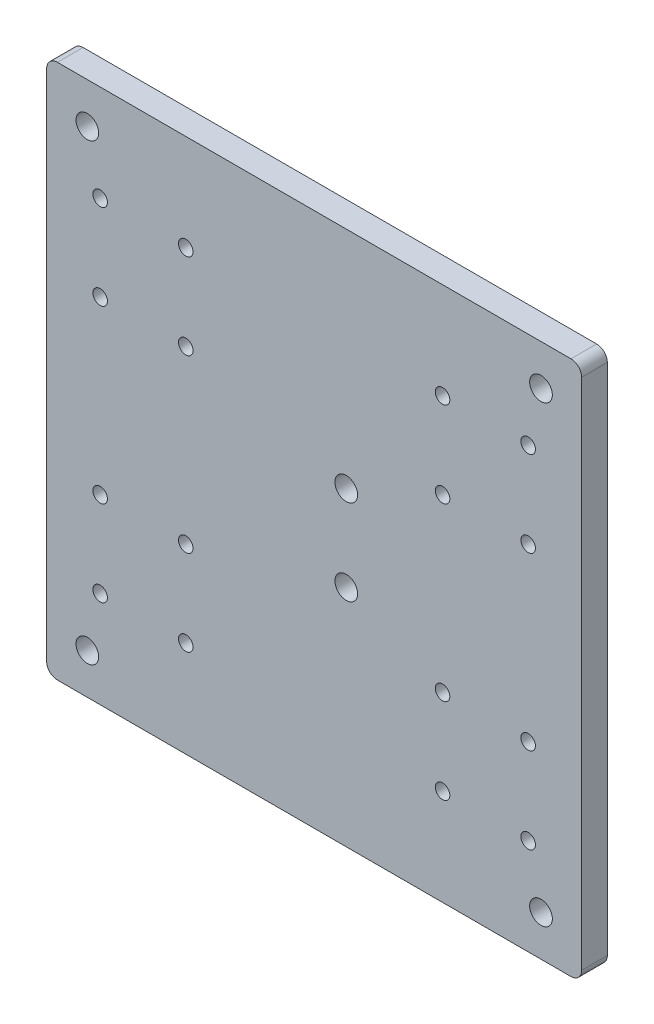
ISO-10303-21;
HEADER;
FILE_DESCRIPTION(('STEP AP214'),'2;1');
FILE_NAME('part.step','',(''),(''),'','','');
FILE_SCHEMA(('AUTOMOTIVE_DESIGN { 1 0 10303 214 1 1 1 1 }'));
ENDSEC;
DATA;
#1=APPLICATION_CONTEXT('core data for automotive mechanical design processes');
#2=APPLICATION_PROTOCOL_DEFINITION('international standard','automotive_design',2000,#1);
#3=PRODUCT_CONTEXT('',#1,'mechanical');
#4=PRODUCT('Part','Part','',(#3));
#5=PRODUCT_RELATED_PRODUCT_CATEGORY('part','',(#4));
#6=PRODUCT_DEFINITION_FORMATION('','',#4);
#7=PRODUCT_DEFINITION_CONTEXT('part definition',#1,'design');
#8=PRODUCT_DEFINITION('design','',#6,#7);
#9=PRODUCT_DEFINITION_SHAPE('','',#8);
#10=(LENGTH_UNIT() NAMED_UNIT(*) SI_UNIT(.MILLI.,.METRE.));
#11=(NAMED_UNIT(*) PLANE_ANGLE_UNIT() SI_UNIT($,.RADIAN.));
#12=(NAMED_UNIT(*) SI_UNIT($,.STERADIAN.) SOLID_ANGLE_UNIT());
#13=UNCERTAINTY_MEASURE_WITH_UNIT(LENGTH_MEASURE(1.E-05),#10,'distance_accuracy_value','');
#14=(GEOMETRIC_REPRESENTATION_CONTEXT(3) GLOBAL_UNCERTAINTY_ASSIGNED_CONTEXT((#13)) GLOBAL_UNIT_ASSIGNED_CONTEXT((#10,
#11,#12)) REPRESENTATION_CONTEXT('',''));
#15=CARTESIAN_POINT('',(0.,0.,0.));
#16=DIRECTION('',(0.,0.,1.));
#17=DIRECTION('',(1.,0.,0.));
#18=AXIS2_PLACEMENT_3D('',#15,#16,#17);
#19=CARTESIAN_POINT('',(0.,0.,6.));
#20=DIRECTION('',(0.,0.,1.));
#21=DIRECTION('',(1.,0.,0.));
#22=AXIS2_PLACEMENT_3D('',#19,#20,#21);
#23=PLANE('',#22);
#24=CARTESIAN_POINT('',(53.,53.,6.));
#25=DIRECTION('',(0.,0.,1.));
#26=DIRECTION('',(1.,0.,0.));
#27=AXIS2_PLACEMENT_3D('',#24,#25,#26);
#28=CIRCLE('',#27,2.65);
#29=CARTESIAN_POINT('',(55.65,53.,6.));
#30=VERTEX_POINT('',#29);
#31=EDGE_CURVE('E302',#30,#30,#28,.T.);
#32=ORIENTED_EDGE('',*,*,#31,.F.);
#33=EDGE_LOOP('',(#32));
#34=FACE_BOUND('',#33,.T.);
#35=CARTESIAN_POINT('',(7.5,-10.,6.));
#36=DIRECTION('',(0.,0.,1.));
#37=DIRECTION('',(1.,0.,0.));
#38=AXIS2_PLACEMENT_3D('',#35,#36,#37);
#39=CIRCLE('',#38,2.65);
#40=CARTESIAN_POINT('',(10.15,-10.,6.));
#41=VERTEX_POINT('',#40);
#42=EDGE_CURVE('E290',#41,#41,#39,.T.);
#43=ORIENTED_EDGE('',*,*,#42,.F.);
#44=EDGE_LOOP('',(#43));
#45=FACE_BOUND('',#44,.T.);
#46=CARTESIAN_POINT('',(50.,-40.,6.));
#47=DIRECTION('',(0.,0.,1.));
#48=DIRECTION('',(1.,0.,0.));
#49=AXIS2_PLACEMENT_3D('',#46,#47,#48);
#50=CIRCLE('',#49,1.7);
#51=CARTESIAN_POINT('',(51.7,-40.,6.));
#52=VERTEX_POINT('',#51);
#53=EDGE_CURVE('E278',#52,#52,#50,.T.);
#54=ORIENTED_EDGE('',*,*,#53,.F.);
#55=EDGE_LOOP('',(#54));
#56=FACE_BOUND('',#55,.T.);
#57=CARTESIAN_POINT('',(30.,-20.,6.));
#58=DIRECTION('',(0.,0.,1.));
#59=DIRECTION('',(1.,0.,0.));
#60=AXIS2_PLACEMENT_3D('',#57,#58,#59);
#61=CIRCLE('',#60,1.69999999999999);
#62=CARTESIAN_POINT('',(31.7,-20.,6.));
#63=VERTEX_POINT('',#62);
#64=EDGE_CURVE('E266',#63,#63,#61,.T.);
#65=ORIENTED_EDGE('',*,*,#64,.F.);
#66=EDGE_LOOP('',(#65));
#67=FACE_BOUND('',#66,.T.);
#68=CARTESIAN_POINT('',(-50.,-40.,6.));
#69=DIRECTION('',(0.,0.,1.));
#70=DIRECTION('',(-1.,0.,0.));
#71=AXIS2_PLACEMENT_3D('',#68,#69,#70);
#72=CIRCLE('',#71,1.7);
#73=CARTESIAN_POINT('',(-51.7,-40.,6.));
#74=VERTEX_POINT('',#73);
#75=EDGE_CURVE('E254',#74,#74,#72,.T.);
#76=ORIENTED_EDGE('',*,*,#75,.F.);
#77=EDGE_LOOP('',(#76));
#78=FACE_BOUND('',#77,.T.);
#79=CARTESIAN_POINT('',(-30.,-20.,6.));
#80=DIRECTION('',(0.,0.,1.));
#81=DIRECTION('',(-1.,0.,0.));
#82=AXIS2_PLACEMENT_3D('',#79,#80,#81);
#83=CIRCLE('',#82,1.7);
#84=CARTESIAN_POINT('',(-31.7,-20.,6.));
#85=VERTEX_POINT('',#84);
#86=EDGE_CURVE('E242',#85,#85,#83,.T.);
#87=ORIENTED_EDGE('',*,*,#86,.F.);
#88=EDGE_LOOP('',(#87));
#89=FACE_BOUND('',#88,.T.);
#90=CARTESIAN_POINT('',(30.,40.,6.));
#91=DIRECTION('',(0.,0.,1.));
#92=DIRECTION('',(-1.,0.,0.));
#93=AXIS2_PLACEMENT_3D('',#90,#91,#92);
#94=CIRCLE('',#93,1.69999999999999);
#95=CARTESIAN_POINT('',(28.3,40.,6.));
#96=VERTEX_POINT('',#95);
#97=EDGE_CURVE('E230',#96,#96,#94,.T.);
#98=ORIENTED_EDGE('',*,*,#97,.F.);
#99=EDGE_LOOP('',(#98));
#100=FACE_BOUND('',#99,.T.);
#101=CARTESIAN_POINT('',(50.,20.,6.));
#102=DIRECTION('',(0.,0.,1.));
#103=DIRECTION('',(-1.,0.,0.));
#104=AXIS2_PLACEMENT_3D('',#101,#102,#103);
#105=CIRCLE('',#104,1.7);
#106=CARTESIAN_POINT('',(48.3,20.,6.));
#107=VERTEX_POINT('',#106);
#108=EDGE_CURVE('E218',#107,#107,#105,.T.);
#109=ORIENTED_EDGE('',*,*,#108,.F.);
#110=EDGE_LOOP('',(#109));
#111=FACE_BOUND('',#110,.T.);
#112=CARTESIAN_POINT('',(-50.,20.,6.));
#113=DIRECTION('',(0.,0.,1.));
#114=DIRECTION('',(1.,0.,0.));
#115=AXIS2_PLACEMENT_3D('',#112,#113,#114);
#116=CIRCLE('',#115,1.7);
#117=CARTESIAN_POINT('',(-48.3,20.,6.));
#118=VERTEX_POINT('',#117);
#119=EDGE_CURVE('E206',#118,#118,#116,.T.);
#120=ORIENTED_EDGE('',*,*,#119,.F.);
#121=EDGE_LOOP('',(#120));
#122=FACE_BOUND('',#121,.T.);
#123=CARTESIAN_POINT('',(-30.,40.,6.));
#124=DIRECTION('',(0.,0.,1.));
#125=DIRECTION('',(1.,0.,0.));
#126=AXIS2_PLACEMENT_3D('',#123,#124,#125);
#127=CIRCLE('',#126,1.7);
#128=CARTESIAN_POINT('',(-28.3,40.,6.));
#129=VERTEX_POINT('',#128);
#130=EDGE_CURVE('E194',#129,#129,#127,.T.);
#131=ORIENTED_EDGE('',*,*,#130,.F.);
#132=EDGE_LOOP('',(#131));
#133=FACE_BOUND('',#132,.T.);
#134=CARTESIAN_POINT('',(-53.,-53.,6.));
#135=DIRECTION('',(0.,0.,1.));
#136=DIRECTION('',(1.,0.,0.));
#137=AXIS2_PLACEMENT_3D('',#134,#135,#136);
#138=CIRCLE('',#137,2.65);
#139=CARTESIAN_POINT('',(-50.35,-53.,6.));
#140=VERTEX_POINT('',#139);
#141=EDGE_CURVE('E140',#140,#140,#138,.T.);
#142=ORIENTED_EDGE('',*,*,#141,.F.);
#143=EDGE_LOOP('',(#142));
#144=FACE_BOUND('',#143,.T.);
#145=DIRECTION('',(0.,-1.,0.));
#146=VECTOR('',#145,1.);
#147=CARTESIAN_POINT('',(-62.5,-62.5,6.));
#148=LINE('',#147,#146);
#149=CARTESIAN_POINT('',(-62.5,60.,6.));
#150=VERTEX_POINT('',#149);
#151=CARTESIAN_POINT('',(-62.5,-60.,6.));
#152=VERTEX_POINT('',#151);
#153=EDGE_CURVE('E145',#150,#152,#148,.T.);
#154=ORIENTED_EDGE('',*,*,#153,.T.);
#155=CARTESIAN_POINT('',(-60.,-60.,6.));
#156=DIRECTION('',(0.,0.,1.));
#157=DIRECTION('',(1.,0.,0.));
#158=AXIS2_PLACEMENT_3D('',#155,#156,#157);
#159=CIRCLE('',#158,2.5);
#160=CARTESIAN_POINT('',(-60.,-62.5,6.));
#161=VERTEX_POINT('',#160);
#162=EDGE_CURVE('E160',#152,#161,#159,.T.);
#163=ORIENTED_EDGE('',*,*,#162,.T.);
#164=DIRECTION('',(1.,0.,0.));
#165=VECTOR('',#164,1.);
#166=CARTESIAN_POINT('',(62.5,-62.5,6.));
#167=LINE('',#166,#165);
#168=CARTESIAN_POINT('',(60.,-62.5,6.));
#169=VERTEX_POINT('',#168);
#170=EDGE_CURVE('E127',#161,#169,#167,.T.);
#171=ORIENTED_EDGE('',*,*,#170,.T.);
#172=CARTESIAN_POINT('',(60.,-60.,6.));
#173=DIRECTION('',(0.,0.,1.));
#174=DIRECTION('',(1.,0.,0.));
#175=AXIS2_PLACEMENT_3D('',#172,#173,#174);
#176=CIRCLE('',#175,2.5);
#177=CARTESIAN_POINT('',(62.5,-60.,6.));
#178=VERTEX_POINT('',#177);
#179=EDGE_CURVE('E158',#169,#178,#176,.T.);
#180=ORIENTED_EDGE('',*,*,#179,.T.);
#181=DIRECTION('',(0.,1.,0.));
#182=VECTOR('',#181,1.);
#183=CARTESIAN_POINT('',(62.5,-62.5,6.));
#184=LINE('',#183,#182);
#185=CARTESIAN_POINT('',(62.5,60.,6.));
#186=VERTEX_POINT('',#185);
#187=EDGE_CURVE('E171',#178,#186,#184,.T.);
#188=ORIENTED_EDGE('',*,*,#187,.T.);
#189=CARTESIAN_POINT('',(60.,60.,6.));
#190=DIRECTION('',(0.,0.,1.));
#191=DIRECTION('',(1.,0.,0.));
#192=AXIS2_PLACEMENT_3D('',#189,#190,#191);
#193=CIRCLE('',#192,2.5);
#194=CARTESIAN_POINT('',(60.,62.5,6.));
#195=VERTEX_POINT('',#194);
#196=EDGE_CURVE('E62',#186,#195,#193,.T.);
#197=ORIENTED_EDGE('',*,*,#196,.T.);
#198=DIRECTION('',(-1.,0.,0.));
#199=VECTOR('',#198,1.);
#200=CARTESIAN_POINT('',(62.5,62.5,6.));
#201=LINE('',#200,#199);
#202=CARTESIAN_POINT('',(-60.,62.5,6.));
#203=VERTEX_POINT('',#202);
#204=EDGE_CURVE('E146',#195,#203,#201,.T.);
#205=ORIENTED_EDGE('',*,*,#204,.T.);
#206=CARTESIAN_POINT('',(-60.,60.,6.));
#207=DIRECTION('',(0.,0.,1.));
#208=DIRECTION('',(1.,0.,0.));
#209=AXIS2_PLACEMENT_3D('',#206,#207,#208);
#210=CIRCLE('',#209,2.5);
#211=EDGE_CURVE('E155',#203,#150,#210,.T.);
#212=ORIENTED_EDGE('',*,*,#211,.T.);
#213=EDGE_LOOP('',(#154,#163,#171,#180,#188,#197,#205,#212));
#214=FACE_BOUND('',#213,.T.);
#215=CARTESIAN_POINT('',(-50.,40.,6.));
#216=DIRECTION('',(0.,0.,1.));
#217=DIRECTION('',(1.,0.,0.));
#218=AXIS2_PLACEMENT_3D('',#215,#216,#217);
#219=CIRCLE('',#218,1.7);
#220=CARTESIAN_POINT('',(-48.3,40.,6.));
#221=VERTEX_POINT('',#220);
#222=EDGE_CURVE('E188',#221,#221,#219,.T.);
#223=ORIENTED_EDGE('',*,*,#222,.F.);
#224=EDGE_LOOP('',(#223));
#225=FACE_BOUND('',#224,.T.);
#226=CARTESIAN_POINT('',(-30.,20.,6.));
#227=DIRECTION('',(0.,0.,1.));
#228=DIRECTION('',(1.,0.,0.));
#229=AXIS2_PLACEMENT_3D('',#226,#227,#228);
#230=CIRCLE('',#229,1.7);
#231=CARTESIAN_POINT('',(-28.3,20.,6.));
#232=VERTEX_POINT('',#231);
#233=EDGE_CURVE('E200',#232,#232,#230,.T.);
#234=ORIENTED_EDGE('',*,*,#233,.F.);
#235=EDGE_LOOP('',(#234));
#236=FACE_BOUND('',#235,.T.);
#237=CARTESIAN_POINT('',(50.,40.,6.));
#238=DIRECTION('',(0.,0.,1.));
#239=DIRECTION('',(-1.,0.,0.));
#240=AXIS2_PLACEMENT_3D('',#237,#238,#239);
#241=CIRCLE('',#240,1.7);
#242=CARTESIAN_POINT('',(48.3,40.,6.));
#243=VERTEX_POINT('',#242);
#244=EDGE_CURVE('E212',#243,#243,#241,.T.);
#245=ORIENTED_EDGE('',*,*,#244,.F.);
#246=EDGE_LOOP('',(#245));
#247=FACE_BOUND('',#246,.T.);
#248=CARTESIAN_POINT('',(30.,20.,6.));
#249=DIRECTION('',(0.,0.,1.));
#250=DIRECTION('',(-1.,0.,0.));
#251=AXIS2_PLACEMENT_3D('',#248,#249,#250);
#252=CIRCLE('',#251,1.69999999999999);
#253=CARTESIAN_POINT('',(28.3,20.,6.));
#254=VERTEX_POINT('',#253);
#255=EDGE_CURVE('E224',#254,#254,#252,.T.);
#256=ORIENTED_EDGE('',*,*,#255,.F.);
#257=EDGE_LOOP('',(#256));
#258=FACE_BOUND('',#257,.T.);
#259=CARTESIAN_POINT('',(-50.,-20.,6.));
#260=DIRECTION('',(0.,0.,1.));
#261=DIRECTION('',(-1.,0.,0.));
#262=AXIS2_PLACEMENT_3D('',#259,#260,#261);
#263=CIRCLE('',#262,1.7);
#264=CARTESIAN_POINT('',(-51.7,-20.,6.));
#265=VERTEX_POINT('',#264);
#266=EDGE_CURVE('E236',#265,#265,#263,.T.);
#267=ORIENTED_EDGE('',*,*,#266,.F.);
#268=EDGE_LOOP('',(#267));
#269=FACE_BOUND('',#268,.T.);
#270=CARTESIAN_POINT('',(-30.,-40.,6.));
#271=DIRECTION('',(0.,0.,1.));
#272=DIRECTION('',(-1.,0.,0.));
#273=AXIS2_PLACEMENT_3D('',#270,#271,#272);
#274=CIRCLE('',#273,1.7);
#275=CARTESIAN_POINT('',(-31.7,-40.,6.));
#276=VERTEX_POINT('',#275);
#277=EDGE_CURVE('E248',#276,#276,#274,.T.);
#278=ORIENTED_EDGE('',*,*,#277,.F.);
#279=EDGE_LOOP('',(#278));
#280=FACE_BOUND('',#279,.T.);
#281=CARTESIAN_POINT('',(30.,-40.,6.));
#282=DIRECTION('',(0.,0.,1.));
#283=DIRECTION('',(1.,0.,0.));
#284=AXIS2_PLACEMENT_3D('',#281,#282,#283);
#285=CIRCLE('',#284,1.7);
#286=CARTESIAN_POINT('',(31.7,-40.,6.));
#287=VERTEX_POINT('',#286);
#288=EDGE_CURVE('E260',#287,#287,#285,.T.);
#289=ORIENTED_EDGE('',*,*,#288,.F.);
#290=EDGE_LOOP('',(#289));
#291=FACE_BOUND('',#290,.T.);
#292=CARTESIAN_POINT('',(50.,-20.,6.));
#293=DIRECTION('',(0.,0.,1.));
#294=DIRECTION('',(1.,0.,0.));
#295=AXIS2_PLACEMENT_3D('',#292,#293,#294);
#296=CIRCLE('',#295,1.7);
#297=CARTESIAN_POINT('',(51.7,-20.,6.));
#298=VERTEX_POINT('',#297);
#299=EDGE_CURVE('E272',#298,#298,#296,.T.);
#300=ORIENTED_EDGE('',*,*,#299,.F.);
#301=EDGE_LOOP('',(#300));
#302=FACE_BOUND('',#301,.T.);
#303=CARTESIAN_POINT('',(7.5,10.,6.));
#304=DIRECTION('',(0.,0.,1.));
#305=DIRECTION('',(1.,0.,0.));
#306=AXIS2_PLACEMENT_3D('',#303,#304,#305);
#307=CIRCLE('',#306,2.65);
#308=CARTESIAN_POINT('',(10.15,10.,6.));
#309=VERTEX_POINT('',#308);
#310=EDGE_CURVE('E284',#309,#309,#307,.T.);
#311=ORIENTED_EDGE('',*,*,#310,.F.);
#312=EDGE_LOOP('',(#311));
#313=FACE_BOUND('',#312,.T.);
#314=CARTESIAN_POINT('',(53.,-53.,6.));
#315=DIRECTION('',(0.,0.,1.));
#316=DIRECTION('',(1.,0.,0.));
#317=AXIS2_PLACEMENT_3D('',#314,#315,#316);
#318=CIRCLE('',#317,2.65);
#319=CARTESIAN_POINT('',(55.65,-53.,6.));
#320=VERTEX_POINT('',#319);
#321=EDGE_CURVE('E296',#320,#320,#318,.T.);
#322=ORIENTED_EDGE('',*,*,#321,.F.);
#323=EDGE_LOOP('',(#322));
#324=FACE_BOUND('',#323,.T.);
#325=CARTESIAN_POINT('',(-53.,53.,6.));
#326=DIRECTION('',(0.,0.,1.));
#327=DIRECTION('',(1.,0.,0.));
#328=AXIS2_PLACEMENT_3D('',#325,#326,#327);
#329=CIRCLE('',#328,2.65);
#330=CARTESIAN_POINT('',(-50.35,53.,6.));
#331=VERTEX_POINT('',#330);
#332=EDGE_CURVE('E308',#331,#331,#329,.T.);
#333=ORIENTED_EDGE('',*,*,#332,.F.);
#334=EDGE_LOOP('',(#333));
#335=FACE_BOUND('',#334,.T.);
#336=ADVANCED_FACE('F41',(#34,#45,#56,#67,#78,#89,#100,#111,#122,#133,#144,#214,#225,#236,#247,
#258,#269,#280,#291,#302,#313,#324,#335),#23,.T.);
#337=CARTESIAN_POINT('',(0.,0.,0.));
#338=DIRECTION('',(0.,0.,1.));
#339=DIRECTION('',(1.,0.,0.));
#340=AXIS2_PLACEMENT_3D('',#337,#338,#339);
#341=PLANE('',#340);
#342=DIRECTION('',(1.,0.,0.));
#343=VECTOR('',#342,1.);
#344=CARTESIAN_POINT('',(62.5,-62.5,0.));
#345=LINE('',#344,#343);
#346=CARTESIAN_POINT('',(-60.,-62.5,0.));
#347=VERTEX_POINT('',#346);
#348=CARTESIAN_POINT('',(60.,-62.5,0.));
#349=VERTEX_POINT('',#348);
#350=EDGE_CURVE('E124',#347,#349,#345,.T.);
#351=ORIENTED_EDGE('',*,*,#350,.F.);
#352=CARTESIAN_POINT('',(-60.,-60.,0.));
#353=DIRECTION('',(0.,0.,1.));
#354=DIRECTION('',(1.,0.,0.));
#355=AXIS2_PLACEMENT_3D('',#352,#353,#354);
#356=CIRCLE('',#355,2.5);
#357=CARTESIAN_POINT('',(-62.5,-60.,0.));
#358=VERTEX_POINT('',#357);
#359=EDGE_CURVE('E107',#347,#358,#356,.F.);
#360=ORIENTED_EDGE('',*,*,#359,.T.);
#361=DIRECTION('',(0.,-1.,0.));
#362=VECTOR('',#361,1.);
#363=CARTESIAN_POINT('',(-62.5,-62.5,0.));
#364=LINE('',#363,#362);
#365=CARTESIAN_POINT('',(-62.5,60.,0.));
#366=VERTEX_POINT('',#365);
#367=EDGE_CURVE('E135',#366,#358,#364,.T.);
#368=ORIENTED_EDGE('',*,*,#367,.F.);
#369=CARTESIAN_POINT('',(-60.,60.,0.));
#370=DIRECTION('',(0.,0.,1.));
#371=DIRECTION('',(1.,0.,0.));
#372=AXIS2_PLACEMENT_3D('',#369,#370,#371);
#373=CIRCLE('',#372,2.5);
#374=CARTESIAN_POINT('',(-60.,62.5,0.));
#375=VERTEX_POINT('',#374);
#376=EDGE_CURVE('E128',#366,#375,#373,.F.);
#377=ORIENTED_EDGE('',*,*,#376,.T.);
#378=DIRECTION('',(-1.,0.,0.));
#379=VECTOR('',#378,1.);
#380=CARTESIAN_POINT('',(62.5,62.5,0.));
#381=LINE('',#380,#379);
#382=CARTESIAN_POINT('',(60.,62.5,0.));
#383=VERTEX_POINT('',#382);
#384=EDGE_CURVE('E138',#383,#375,#381,.T.);
#385=ORIENTED_EDGE('',*,*,#384,.F.);
#386=CARTESIAN_POINT('',(60.,60.,0.));
#387=DIRECTION('',(0.,0.,1.));
#388=DIRECTION('',(1.,0.,0.));
#389=AXIS2_PLACEMENT_3D('',#386,#387,#388);
#390=CIRCLE('',#389,2.5);
#391=CARTESIAN_POINT('',(62.5,60.,0.));
#392=VERTEX_POINT('',#391);
#393=EDGE_CURVE('E149',#383,#392,#390,.F.);
#394=ORIENTED_EDGE('',*,*,#393,.T.);
#395=DIRECTION('',(0.,1.,0.));
#396=VECTOR('',#395,1.);
#397=CARTESIAN_POINT('',(62.5,-62.5,0.));
#398=LINE('',#397,#396);
#399=CARTESIAN_POINT('',(62.5,-60.,0.));
#400=VERTEX_POINT('',#399);
#401=EDGE_CURVE('E134',#400,#392,#398,.T.);
#402=ORIENTED_EDGE('',*,*,#401,.F.);
#403=CARTESIAN_POINT('',(60.,-60.,0.));
#404=DIRECTION('',(0.,0.,1.));
#405=DIRECTION('',(1.,0.,0.));
#406=AXIS2_PLACEMENT_3D('',#403,#404,#405);
#407=CIRCLE('',#406,2.5);
#408=EDGE_CURVE('E118',#400,#349,#407,.F.);
#409=ORIENTED_EDGE('',*,*,#408,.T.);
#410=EDGE_LOOP('',(#351,#360,#368,#377,#385,#394,#402,#409));
#411=FACE_BOUND('',#410,.T.);
#412=CARTESIAN_POINT('',(-53.,-53.,0.));
#413=DIRECTION('',(0.,0.,1.));
#414=DIRECTION('',(1.,0.,0.));
#415=AXIS2_PLACEMENT_3D('',#412,#413,#414);
#416=CIRCLE('',#415,2.65);
#417=CARTESIAN_POINT('',(-50.35,-53.,0.));
#418=VERTEX_POINT('',#417);
#419=EDGE_CURVE('E185',#418,#418,#416,.T.);
#420=ORIENTED_EDGE('',*,*,#419,.T.);
#421=EDGE_LOOP('',(#420));
#422=FACE_BOUND('',#421,.T.);
#423=CARTESIAN_POINT('',(-50.,40.,0.));
#424=DIRECTION('',(0.,0.,1.));
#425=DIRECTION('',(1.,0.,0.));
#426=AXIS2_PLACEMENT_3D('',#423,#424,#425);
#427=CIRCLE('',#426,1.7);
#428=CARTESIAN_POINT('',(-48.3,40.,0.));
#429=VERTEX_POINT('',#428);
#430=EDGE_CURVE('E191',#429,#429,#427,.T.);
#431=ORIENTED_EDGE('',*,*,#430,.T.);
#432=EDGE_LOOP('',(#431));
#433=FACE_BOUND('',#432,.T.);
#434=CARTESIAN_POINT('',(-30.,40.,0.));
#435=DIRECTION('',(0.,0.,1.));
#436=DIRECTION('',(1.,0.,0.));
#437=AXIS2_PLACEMENT_3D('',#434,#435,#436);
#438=CIRCLE('',#437,1.7);
#439=CARTESIAN_POINT('',(-28.3,40.,0.));
#440=VERTEX_POINT('',#439);
#441=EDGE_CURVE('E197',#440,#440,#438,.T.);
#442=ORIENTED_EDGE('',*,*,#441,.T.);
#443=EDGE_LOOP('',(#442));
#444=FACE_BOUND('',#443,.T.);
#445=CARTESIAN_POINT('',(-30.,20.,0.));
#446=DIRECTION('',(0.,0.,1.));
#447=DIRECTION('',(1.,0.,0.));
#448=AXIS2_PLACEMENT_3D('',#445,#446,#447);
#449=CIRCLE('',#448,1.7);
#450=CARTESIAN_POINT('',(-28.3,20.,0.));
#451=VERTEX_POINT('',#450);
#452=EDGE_CURVE('E203',#451,#451,#449,.T.);
#453=ORIENTED_EDGE('',*,*,#452,.T.);
#454=EDGE_LOOP('',(#453));
#455=FACE_BOUND('',#454,.T.);
#456=CARTESIAN_POINT('',(-50.,20.,0.));
#457=DIRECTION('',(0.,0.,1.));
#458=DIRECTION('',(1.,0.,0.));
#459=AXIS2_PLACEMENT_3D('',#456,#457,#458);
#460=CIRCLE('',#459,1.7);
#461=CARTESIAN_POINT('',(-48.3,20.,0.));
#462=VERTEX_POINT('',#461);
#463=EDGE_CURVE('E209',#462,#462,#460,.T.);
#464=ORIENTED_EDGE('',*,*,#463,.T.);
#465=EDGE_LOOP('',(#464));
#466=FACE_BOUND('',#465,.T.);
#467=CARTESIAN_POINT('',(50.,40.,0.));
#468=DIRECTION('',(0.,0.,1.));
#469=DIRECTION('',(-1.,0.,0.));
#470=AXIS2_PLACEMENT_3D('',#467,#468,#469);
#471=CIRCLE('',#470,1.7);
#472=CARTESIAN_POINT('',(48.3,40.,0.));
#473=VERTEX_POINT('',#472);
#474=EDGE_CURVE('E215',#473,#473,#471,.T.);
#475=ORIENTED_EDGE('',*,*,#474,.T.);
#476=EDGE_LOOP('',(#475));
#477=FACE_BOUND('',#476,.T.);
#478=CARTESIAN_POINT('',(50.,20.,0.));
#479=DIRECTION('',(0.,0.,1.));
#480=DIRECTION('',(-1.,0.,0.));
#481=AXIS2_PLACEMENT_3D('',#478,#479,#480);
#482=CIRCLE('',#481,1.7);
#483=CARTESIAN_POINT('',(48.3,20.,0.));
#484=VERTEX_POINT('',#483);
#485=EDGE_CURVE('E221',#484,#484,#482,.T.);
#486=ORIENTED_EDGE('',*,*,#485,.T.);
#487=EDGE_LOOP('',(#486));
#488=FACE_BOUND('',#487,.T.);
#489=CARTESIAN_POINT('',(30.,20.,0.));
#490=DIRECTION('',(0.,0.,1.));
#491=DIRECTION('',(-1.,0.,0.));
#492=AXIS2_PLACEMENT_3D('',#489,#490,#491);
#493=CIRCLE('',#492,1.69999999999999);
#494=CARTESIAN_POINT('',(28.3,20.,0.));
#495=VERTEX_POINT('',#494);
#496=EDGE_CURVE('E227',#495,#495,#493,.T.);
#497=ORIENTED_EDGE('',*,*,#496,.T.);
#498=EDGE_LOOP('',(#497));
#499=FACE_BOUND('',#498,.T.);
#500=CARTESIAN_POINT('',(30.,40.,0.));
#501=DIRECTION('',(0.,0.,1.));
#502=DIRECTION('',(-1.,0.,0.));
#503=AXIS2_PLACEMENT_3D('',#500,#501,#502);
#504=CIRCLE('',#503,1.69999999999999);
#505=CARTESIAN_POINT('',(28.3,40.,0.));
#506=VERTEX_POINT('',#505);
#507=EDGE_CURVE('E233',#506,#506,#504,.T.);
#508=ORIENTED_EDGE('',*,*,#507,.T.);
#509=EDGE_LOOP('',(#508));
#510=FACE_BOUND('',#509,.T.);
#511=CARTESIAN_POINT('',(-50.,-20.,0.));
#512=DIRECTION('',(0.,0.,1.));
#513=DIRECTION('',(-1.,0.,0.));
#514=AXIS2_PLACEMENT_3D('',#511,#512,#513);
#515=CIRCLE('',#514,1.7);
#516=CARTESIAN_POINT('',(-51.7,-20.,0.));
#517=VERTEX_POINT('',#516);
#518=EDGE_CURVE('E239',#517,#517,#515,.T.);
#519=ORIENTED_EDGE('',*,*,#518,.T.);
#520=EDGE_LOOP('',(#519));
#521=FACE_BOUND('',#520,.T.);
#522=CARTESIAN_POINT('',(-30.,-20.,0.));
#523=DIRECTION('',(0.,0.,1.));
#524=DIRECTION('',(-1.,0.,0.));
#525=AXIS2_PLACEMENT_3D('',#522,#523,#524);
#526=CIRCLE('',#525,1.7);
#527=CARTESIAN_POINT('',(-31.7,-20.,0.));
#528=VERTEX_POINT('',#527);
#529=EDGE_CURVE('E245',#528,#528,#526,.T.);
#530=ORIENTED_EDGE('',*,*,#529,.T.);
#531=EDGE_LOOP('',(#530));
#532=FACE_BOUND('',#531,.T.);
#533=CARTESIAN_POINT('',(-30.,-40.,0.));
#534=DIRECTION('',(0.,0.,1.));
#535=DIRECTION('',(-1.,0.,0.));
#536=AXIS2_PLACEMENT_3D('',#533,#534,#535);
#537=CIRCLE('',#536,1.7);
#538=CARTESIAN_POINT('',(-31.7,-40.,0.));
#539=VERTEX_POINT('',#538);
#540=EDGE_CURVE('E251',#539,#539,#537,.T.);
#541=ORIENTED_EDGE('',*,*,#540,.T.);
#542=EDGE_LOOP('',(#541));
#543=FACE_BOUND('',#542,.T.);
#544=CARTESIAN_POINT('',(-50.,-40.,0.));
#545=DIRECTION('',(0.,0.,1.));
#546=DIRECTION('',(-1.,0.,0.));
#547=AXIS2_PLACEMENT_3D('',#544,#545,#546);
#548=CIRCLE('',#547,1.7);
#549=CARTESIAN_POINT('',(-51.7,-40.,0.));
#550=VERTEX_POINT('',#549);
#551=EDGE_CURVE('E257',#550,#550,#548,.T.);
#552=ORIENTED_EDGE('',*,*,#551,.T.);
#553=EDGE_LOOP('',(#552));
#554=FACE_BOUND('',#553,.T.);
#555=CARTESIAN_POINT('',(30.,-40.,0.));
#556=DIRECTION('',(0.,0.,1.));
#557=DIRECTION('',(1.,0.,0.));
#558=AXIS2_PLACEMENT_3D('',#555,#556,#557);
#559=CIRCLE('',#558,1.7);
#560=CARTESIAN_POINT('',(31.7,-40.,0.));
#561=VERTEX_POINT('',#560);
#562=EDGE_CURVE('E263',#561,#561,#559,.T.);
#563=ORIENTED_EDGE('',*,*,#562,.T.);
#564=EDGE_LOOP('',(#563));
#565=FACE_BOUND('',#564,.T.);
#566=CARTESIAN_POINT('',(30.,-20.,0.));
#567=DIRECTION('',(0.,0.,1.));
#568=DIRECTION('',(1.,0.,0.));
#569=AXIS2_PLACEMENT_3D('',#566,#567,#568);
#570=CIRCLE('',#569,1.69999999999999);
#571=CARTESIAN_POINT('',(31.7,-20.,0.));
#572=VERTEX_POINT('',#571);
#573=EDGE_CURVE('E269',#572,#572,#570,.T.);
#574=ORIENTED_EDGE('',*,*,#573,.T.);
#575=EDGE_LOOP('',(#574));
#576=FACE_BOUND('',#575,.T.);
#577=CARTESIAN_POINT('',(50.,-20.,0.));
#578=DIRECTION('',(0.,0.,1.));
#579=DIRECTION('',(1.,0.,0.));
#580=AXIS2_PLACEMENT_3D('',#577,#578,#579);
#581=CIRCLE('',#580,1.7);
#582=CARTESIAN_POINT('',(51.7,-20.,0.));
#583=VERTEX_POINT('',#582);
#584=EDGE_CURVE('E275',#583,#583,#581,.T.);
#585=ORIENTED_EDGE('',*,*,#584,.T.);
#586=EDGE_LOOP('',(#585));
#587=FACE_BOUND('',#586,.T.);
#588=CARTESIAN_POINT('',(50.,-40.,0.));
#589=DIRECTION('',(0.,0.,1.));
#590=DIRECTION('',(1.,0.,0.));
#591=AXIS2_PLACEMENT_3D('',#588,#589,#590);
#592=CIRCLE('',#591,1.7);
#593=CARTESIAN_POINT('',(51.7,-40.,0.));
#594=VERTEX_POINT('',#593);
#595=EDGE_CURVE('E281',#594,#594,#592,.T.);
#596=ORIENTED_EDGE('',*,*,#595,.T.);
#597=EDGE_LOOP('',(#596));
#598=FACE_BOUND('',#597,.T.);
#599=CARTESIAN_POINT('',(7.5,10.,0.));
#600=DIRECTION('',(0.,0.,1.));
#601=DIRECTION('',(1.,0.,0.));
#602=AXIS2_PLACEMENT_3D('',#599,#600,#601);
#603=CIRCLE('',#602,2.65);
#604=CARTESIAN_POINT('',(10.15,10.,0.));
#605=VERTEX_POINT('',#604);
#606=EDGE_CURVE('E287',#605,#605,#603,.T.);
#607=ORIENTED_EDGE('',*,*,#606,.T.);
#608=EDGE_LOOP('',(#607));
#609=FACE_BOUND('',#608,.T.);
#610=CARTESIAN_POINT('',(7.5,-10.,0.));
#611=DIRECTION('',(0.,0.,1.));
#612=DIRECTION('',(1.,0.,0.));
#613=AXIS2_PLACEMENT_3D('',#610,#611,#612);
#614=CIRCLE('',#613,2.65);
#615=CARTESIAN_POINT('',(10.15,-10.,0.));
#616=VERTEX_POINT('',#615);
#617=EDGE_CURVE('E293',#616,#616,#614,.T.);
#618=ORIENTED_EDGE('',*,*,#617,.T.);
#619=EDGE_LOOP('',(#618));
#620=FACE_BOUND('',#619,.T.);
#621=CARTESIAN_POINT('',(53.,-53.,0.));
#622=DIRECTION('',(0.,0.,1.));
#623=DIRECTION('',(1.,0.,0.));
#624=AXIS2_PLACEMENT_3D('',#621,#622,#623);
#625=CIRCLE('',#624,2.65);
#626=CARTESIAN_POINT('',(55.65,-53.,0.));
#627=VERTEX_POINT('',#626);
#628=EDGE_CURVE('E299',#627,#627,#625,.T.);
#629=ORIENTED_EDGE('',*,*,#628,.T.);
#630=EDGE_LOOP('',(#629));
#631=FACE_BOUND('',#630,.T.);
#632=CARTESIAN_POINT('',(53.,53.,0.));
#633=DIRECTION('',(0.,0.,1.));
#634=DIRECTION('',(1.,0.,0.));
#635=AXIS2_PLACEMENT_3D('',#632,#633,#634);
#636=CIRCLE('',#635,2.65);
#637=CARTESIAN_POINT('',(55.65,53.,0.));
#638=VERTEX_POINT('',#637);
#639=EDGE_CURVE('E305',#638,#638,#636,.T.);
#640=ORIENTED_EDGE('',*,*,#639,.T.);
#641=EDGE_LOOP('',(#640));
#642=FACE_BOUND('',#641,.T.);
#643=CARTESIAN_POINT('',(-53.,53.,0.));
#644=DIRECTION('',(0.,0.,1.));
#645=DIRECTION('',(1.,0.,0.));
#646=AXIS2_PLACEMENT_3D('',#643,#644,#645);
#647=CIRCLE('',#646,2.65);
#648=CARTESIAN_POINT('',(-50.35,53.,0.));
#649=VERTEX_POINT('',#648);
#650=EDGE_CURVE('E311',#649,#649,#647,.T.);
#651=ORIENTED_EDGE('',*,*,#650,.T.);
#652=EDGE_LOOP('',(#651));
#653=FACE_BOUND('',#652,.T.);
#654=ADVANCED_FACE('F131',(#411,#422,#433,#444,#455,#466,#477,#488,#499,#510,#521,#532,#543,
#554,#565,#576,#587,#598,#609,#620,#631,#642,#653),#341,.F.);
#655=CARTESIAN_POINT('',(-62.5,-62.5,6.));
#656=DIRECTION('',(1.,0.,0.));
#657=DIRECTION('',(0.,0.,-1.));
#658=AXIS2_PLACEMENT_3D('',#655,#656,#657);
#659=PLANE('',#658);
#660=ORIENTED_EDGE('',*,*,#367,.T.);
#661=DIRECTION('',(0.,0.,-1.));
#662=VECTOR('',#661,1.);
#663=CARTESIAN_POINT('',(-62.5,-60.,6.));
#664=LINE('',#663,#662);
#665=EDGE_CURVE('E112',#358,#152,#664,.F.);
#666=ORIENTED_EDGE('',*,*,#665,.T.);
#667=ORIENTED_EDGE('',*,*,#153,.F.);
#668=DIRECTION('',(0.,0.,-1.));
#669=VECTOR('',#668,1.);
#670=CARTESIAN_POINT('',(-62.5,60.,6.));
#671=LINE('',#670,#669);
#672=EDGE_CURVE('E117',#150,#366,#671,.T.);
#673=ORIENTED_EDGE('',*,*,#672,.T.);
#674=EDGE_LOOP('',(#660,#666,#667,#673));
#675=FACE_BOUND('',#674,.T.);
#676=ADVANCED_FACE('F327',(#675),#659,.F.);
#677=CARTESIAN_POINT('',(62.5,-62.5,6.));
#678=DIRECTION('',(0.,1.,0.));
#679=DIRECTION('',(0.,0.,1.));
#680=AXIS2_PLACEMENT_3D('',#677,#678,#679);
#681=PLANE('',#680);
#682=ORIENTED_EDGE('',*,*,#170,.F.);
#683=DIRECTION('',(0.,0.,-1.));
#684=VECTOR('',#683,1.);
#685=CARTESIAN_POINT('',(-60.,-62.5,6.));
#686=LINE('',#685,#684);
#687=EDGE_CURVE('E111',#161,#347,#686,.T.);
#688=ORIENTED_EDGE('',*,*,#687,.T.);
#689=ORIENTED_EDGE('',*,*,#350,.T.);
#690=DIRECTION('',(0.,0.,-1.));
#691=VECTOR('',#690,1.);
#692=CARTESIAN_POINT('',(60.,-62.5,6.));
#693=LINE('',#692,#691);
#694=EDGE_CURVE('E129',#349,#169,#693,.F.);
#695=ORIENTED_EDGE('',*,*,#694,.T.);
#696=EDGE_LOOP('',(#682,#688,#689,#695));
#697=FACE_BOUND('',#696,.T.);
#698=ADVANCED_FACE('F123',(#697),#681,.F.);
#699=CARTESIAN_POINT('',(62.5,-62.5,6.));
#700=DIRECTION('',(-1.,0.,0.));
#701=DIRECTION('',(0.,0.,1.));
#702=AXIS2_PLACEMENT_3D('',#699,#700,#701);
#703=PLANE('',#702);
#704=ORIENTED_EDGE('',*,*,#187,.F.);
#705=DIRECTION('',(0.,0.,-1.));
#706=VECTOR('',#705,1.);
#707=CARTESIAN_POINT('',(62.5,-60.,6.));
#708=LINE('',#707,#706);
#709=EDGE_CURVE('E164',#178,#400,#708,.T.);
#710=ORIENTED_EDGE('',*,*,#709,.T.);
#711=ORIENTED_EDGE('',*,*,#401,.T.);
#712=DIRECTION('',(0.,0.,-1.));
#713=VECTOR('',#712,1.);
#714=CARTESIAN_POINT('',(62.5,60.,6.));
#715=LINE('',#714,#713);
#716=EDGE_CURVE('E162',#392,#186,#715,.F.);
#717=ORIENTED_EDGE('',*,*,#716,.T.);
#718=EDGE_LOOP('',(#704,#710,#711,#717));
#719=FACE_BOUND('',#718,.T.);
#720=ADVANCED_FACE('F169',(#719),#703,.F.);
#721=CARTESIAN_POINT('',(62.5,62.5,6.));
#722=DIRECTION('',(0.,-1.,0.));
#723=DIRECTION('',(0.,0.,-1.));
#724=AXIS2_PLACEMENT_3D('',#721,#722,#723);
#725=PLANE('',#724);
#726=ORIENTED_EDGE('',*,*,#204,.F.);
#727=DIRECTION('',(0.,0.,-1.));
#728=VECTOR('',#727,1.);
#729=CARTESIAN_POINT('',(60.,62.5,6.));
#730=LINE('',#729,#728);
#731=EDGE_CURVE('E11',#195,#383,#730,.T.);
#732=ORIENTED_EDGE('',*,*,#731,.T.);
#733=ORIENTED_EDGE('',*,*,#384,.T.);
#734=DIRECTION('',(0.,0.,-1.));
#735=VECTOR('',#734,1.);
#736=CARTESIAN_POINT('',(-60.,62.5,6.));
#737=LINE('',#736,#735);
#738=EDGE_CURVE('E49',#375,#203,#737,.F.);
#739=ORIENTED_EDGE('',*,*,#738,.T.);
#740=EDGE_LOOP('',(#726,#732,#733,#739));
#741=FACE_BOUND('',#740,.T.);
#742=ADVANCED_FACE('F178',(#741),#725,.F.);
#743=CARTESIAN_POINT('',(-53.,-53.,6.));
#744=DIRECTION('',(0.,0.,-1.));
#745=DIRECTION('',(-1.,0.,0.));
#746=AXIS2_PLACEMENT_3D('',#743,#744,#745);
#747=CYLINDRICAL_SURFACE('',#746,2.65);
#748=ORIENTED_EDGE('',*,*,#141,.T.);
#749=EDGE_LOOP('',(#748));
#750=FACE_BOUND('',#749,.T.);
#751=ORIENTED_EDGE('',*,*,#419,.F.);
#752=EDGE_LOOP('',(#751));
#753=FACE_BOUND('',#752,.T.);
#754=ADVANCED_FACE('F332',(#750,#753),#747,.F.);
#755=CARTESIAN_POINT('',(-50.,40.,6.));
#756=DIRECTION('',(0.,0.,-1.));
#757=DIRECTION('',(-1.,0.,0.));
#758=AXIS2_PLACEMENT_3D('',#755,#756,#757);
#759=CYLINDRICAL_SURFACE('',#758,1.7);
#760=ORIENTED_EDGE('',*,*,#222,.T.);
#761=EDGE_LOOP('',(#760));
#762=FACE_BOUND('',#761,.T.);
#763=ORIENTED_EDGE('',*,*,#430,.F.);
#764=EDGE_LOOP('',(#763));
#765=FACE_BOUND('',#764,.T.);
#766=ADVANCED_FACE('F462',(#762,#765),#759,.F.);
#767=CARTESIAN_POINT('',(-30.,40.,6.));
#768=DIRECTION('',(0.,0.,-1.));
#769=DIRECTION('',(-1.,0.,0.));
#770=AXIS2_PLACEMENT_3D('',#767,#768,#769);
#771=CYLINDRICAL_SURFACE('',#770,1.7);
#772=ORIENTED_EDGE('',*,*,#130,.T.);
#773=EDGE_LOOP('',(#772));
#774=FACE_BOUND('',#773,.T.);
#775=ORIENTED_EDGE('',*,*,#441,.F.);
#776=EDGE_LOOP('',(#775));
#777=FACE_BOUND('',#776,.T.);
#778=ADVANCED_FACE('F459',(#774,#777),#771,.F.);
#779=CARTESIAN_POINT('',(-30.,20.,6.));
#780=DIRECTION('',(0.,0.,-1.));
#781=DIRECTION('',(-1.,0.,0.));
#782=AXIS2_PLACEMENT_3D('',#779,#780,#781);
#783=CYLINDRICAL_SURFACE('',#782,1.7);
#784=ORIENTED_EDGE('',*,*,#233,.T.);
#785=EDGE_LOOP('',(#784));
#786=FACE_BOUND('',#785,.T.);
#787=ORIENTED_EDGE('',*,*,#452,.F.);
#788=EDGE_LOOP('',(#787));
#789=FACE_BOUND('',#788,.T.);
#790=ADVANCED_FACE('F455',(#786,#789),#783,.F.);
#791=CARTESIAN_POINT('',(-50.,20.,6.));
#792=DIRECTION('',(0.,0.,-1.));
#793=DIRECTION('',(-1.,0.,0.));
#794=AXIS2_PLACEMENT_3D('',#791,#792,#793);
#795=CYLINDRICAL_SURFACE('',#794,1.7);
#796=ORIENTED_EDGE('',*,*,#119,.T.);
#797=EDGE_LOOP('',(#796));
#798=FACE_BOUND('',#797,.T.);
#799=ORIENTED_EDGE('',*,*,#463,.F.);
#800=EDGE_LOOP('',(#799));
#801=FACE_BOUND('',#800,.T.);
#802=ADVANCED_FACE('F451',(#798,#801),#795,.F.);
#803=CARTESIAN_POINT('',(50.,40.,6.));
#804=DIRECTION('',(0.,0.,-1.));
#805=DIRECTION('',(-1.,0.,0.));
#806=AXIS2_PLACEMENT_3D('',#803,#804,#805);
#807=CYLINDRICAL_SURFACE('',#806,1.7);
#808=ORIENTED_EDGE('',*,*,#244,.T.);
#809=EDGE_LOOP('',(#808));
#810=FACE_BOUND('',#809,.T.);
#811=ORIENTED_EDGE('',*,*,#474,.F.);
#812=EDGE_LOOP('',(#811));
#813=FACE_BOUND('',#812,.T.);
#814=ADVANCED_FACE('F447',(#810,#813),#807,.F.);
#815=CARTESIAN_POINT('',(50.,20.,6.));
#816=DIRECTION('',(0.,0.,-1.));
#817=DIRECTION('',(-1.,0.,0.));
#818=AXIS2_PLACEMENT_3D('',#815,#816,#817);
#819=CYLINDRICAL_SURFACE('',#818,1.7);
#820=ORIENTED_EDGE('',*,*,#108,.T.);
#821=EDGE_LOOP('',(#820));
#822=FACE_BOUND('',#821,.T.);
#823=ORIENTED_EDGE('',*,*,#485,.F.);
#824=EDGE_LOOP('',(#823));
#825=FACE_BOUND('',#824,.T.);
#826=ADVANCED_FACE('F443',(#822,#825),#819,.F.);
#827=CARTESIAN_POINT('',(30.,20.,6.));
#828=DIRECTION('',(0.,0.,-1.));
#829=DIRECTION('',(-1.,0.,0.));
#830=AXIS2_PLACEMENT_3D('',#827,#828,#829);
#831=CYLINDRICAL_SURFACE('',#830,1.69999999999999);
#832=ORIENTED_EDGE('',*,*,#255,.T.);
#833=EDGE_LOOP('',(#832));
#834=FACE_BOUND('',#833,.T.);
#835=ORIENTED_EDGE('',*,*,#496,.F.);
#836=EDGE_LOOP('',(#835));
#837=FACE_BOUND('',#836,.T.);
#838=ADVANCED_FACE('F439',(#834,#837),#831,.F.);
#839=CARTESIAN_POINT('',(30.,40.,6.));
#840=DIRECTION('',(0.,0.,-1.));
#841=DIRECTION('',(-1.,0.,0.));
#842=AXIS2_PLACEMENT_3D('',#839,#840,#841);
#843=CYLINDRICAL_SURFACE('',#842,1.69999999999999);
#844=ORIENTED_EDGE('',*,*,#97,.T.);
#845=EDGE_LOOP('',(#844));
#846=FACE_BOUND('',#845,.T.);
#847=ORIENTED_EDGE('',*,*,#507,.F.);
#848=EDGE_LOOP('',(#847));
#849=FACE_BOUND('',#848,.T.);
#850=ADVANCED_FACE('F435',(#846,#849),#843,.F.);
#851=CARTESIAN_POINT('',(-50.,-20.,6.));
#852=DIRECTION('',(0.,0.,-1.));
#853=DIRECTION('',(-1.,0.,0.));
#854=AXIS2_PLACEMENT_3D('',#851,#852,#853);
#855=CYLINDRICAL_SURFACE('',#854,1.7);
#856=ORIENTED_EDGE('',*,*,#266,.T.);
#857=EDGE_LOOP('',(#856));
#858=FACE_BOUND('',#857,.T.);
#859=ORIENTED_EDGE('',*,*,#518,.F.);
#860=EDGE_LOOP('',(#859));
#861=FACE_BOUND('',#860,.T.);
#862=ADVANCED_FACE('F431',(#858,#861),#855,.F.);
#863=CARTESIAN_POINT('',(-30.,-20.,6.));
#864=DIRECTION('',(0.,0.,-1.));
#865=DIRECTION('',(-1.,0.,0.));
#866=AXIS2_PLACEMENT_3D('',#863,#864,#865);
#867=CYLINDRICAL_SURFACE('',#866,1.7);
#868=ORIENTED_EDGE('',*,*,#86,.T.);
#869=EDGE_LOOP('',(#868));
#870=FACE_BOUND('',#869,.T.);
#871=ORIENTED_EDGE('',*,*,#529,.F.);
#872=EDGE_LOOP('',(#871));
#873=FACE_BOUND('',#872,.T.);
#874=ADVANCED_FACE('F427',(#870,#873),#867,.F.);
#875=CARTESIAN_POINT('',(-30.,-40.,6.));
#876=DIRECTION('',(0.,0.,-1.));
#877=DIRECTION('',(-1.,0.,0.));
#878=AXIS2_PLACEMENT_3D('',#875,#876,#877);
#879=CYLINDRICAL_SURFACE('',#878,1.7);
#880=ORIENTED_EDGE('',*,*,#277,.T.);
#881=EDGE_LOOP('',(#880));
#882=FACE_BOUND('',#881,.T.);
#883=ORIENTED_EDGE('',*,*,#540,.F.);
#884=EDGE_LOOP('',(#883));
#885=FACE_BOUND('',#884,.T.);
#886=ADVANCED_FACE('F423',(#882,#885),#879,.F.);
#887=CARTESIAN_POINT('',(-50.,-40.,6.));
#888=DIRECTION('',(0.,0.,-1.));
#889=DIRECTION('',(-1.,0.,0.));
#890=AXIS2_PLACEMENT_3D('',#887,#888,#889);
#891=CYLINDRICAL_SURFACE('',#890,1.7);
#892=ORIENTED_EDGE('',*,*,#75,.T.);
#893=EDGE_LOOP('',(#892));
#894=FACE_BOUND('',#893,.T.);
#895=ORIENTED_EDGE('',*,*,#551,.F.);
#896=EDGE_LOOP('',(#895));
#897=FACE_BOUND('',#896,.T.);
#898=ADVANCED_FACE('F419',(#894,#897),#891,.F.);
#899=CARTESIAN_POINT('',(30.,-40.,6.));
#900=DIRECTION('',(0.,0.,-1.));
#901=DIRECTION('',(-1.,0.,0.));
#902=AXIS2_PLACEMENT_3D('',#899,#900,#901);
#903=CYLINDRICAL_SURFACE('',#902,1.7);
#904=ORIENTED_EDGE('',*,*,#288,.T.);
#905=EDGE_LOOP('',(#904));
#906=FACE_BOUND('',#905,.T.);
#907=ORIENTED_EDGE('',*,*,#562,.F.);
#908=EDGE_LOOP('',(#907));
#909=FACE_BOUND('',#908,.T.);
#910=ADVANCED_FACE('F415',(#906,#909),#903,.F.);
#911=CARTESIAN_POINT('',(30.,-20.,6.));
#912=DIRECTION('',(0.,0.,-1.));
#913=DIRECTION('',(-1.,0.,0.));
#914=AXIS2_PLACEMENT_3D('',#911,#912,#913);
#915=CYLINDRICAL_SURFACE('',#914,1.69999999999999);
#916=ORIENTED_EDGE('',*,*,#64,.T.);
#917=EDGE_LOOP('',(#916));
#918=FACE_BOUND('',#917,.T.);
#919=ORIENTED_EDGE('',*,*,#573,.F.);
#920=EDGE_LOOP('',(#919));
#921=FACE_BOUND('',#920,.T.);
#922=ADVANCED_FACE('F411',(#918,#921),#915,.F.);
#923=CARTESIAN_POINT('',(50.,-20.,6.));
#924=DIRECTION('',(0.,0.,-1.));
#925=DIRECTION('',(-1.,0.,0.));
#926=AXIS2_PLACEMENT_3D('',#923,#924,#925);
#927=CYLINDRICAL_SURFACE('',#926,1.7);
#928=ORIENTED_EDGE('',*,*,#299,.T.);
#929=EDGE_LOOP('',(#928));
#930=FACE_BOUND('',#929,.T.);
#931=ORIENTED_EDGE('',*,*,#584,.F.);
#932=EDGE_LOOP('',(#931));
#933=FACE_BOUND('',#932,.T.);
#934=ADVANCED_FACE('F407',(#930,#933),#927,.F.);
#935=CARTESIAN_POINT('',(50.,-40.,6.));
#936=DIRECTION('',(0.,0.,-1.));
#937=DIRECTION('',(-1.,0.,0.));
#938=AXIS2_PLACEMENT_3D('',#935,#936,#937);
#939=CYLINDRICAL_SURFACE('',#938,1.7);
#940=ORIENTED_EDGE('',*,*,#53,.T.);
#941=EDGE_LOOP('',(#940));
#942=FACE_BOUND('',#941,.T.);
#943=ORIENTED_EDGE('',*,*,#595,.F.);
#944=EDGE_LOOP('',(#943));
#945=FACE_BOUND('',#944,.T.);
#946=ADVANCED_FACE('F403',(#942,#945),#939,.F.);
#947=CARTESIAN_POINT('',(7.5,10.,6.));
#948=DIRECTION('',(0.,0.,-1.));
#949=DIRECTION('',(-1.,0.,0.));
#950=AXIS2_PLACEMENT_3D('',#947,#948,#949);
#951=CYLINDRICAL_SURFACE('',#950,2.65);
#952=ORIENTED_EDGE('',*,*,#310,.T.);
#953=EDGE_LOOP('',(#952));
#954=FACE_BOUND('',#953,.T.);
#955=ORIENTED_EDGE('',*,*,#606,.F.);
#956=EDGE_LOOP('',(#955));
#957=FACE_BOUND('',#956,.T.);
#958=ADVANCED_FACE('F399',(#954,#957),#951,.F.);
#959=CARTESIAN_POINT('',(7.5,-10.,6.));
#960=DIRECTION('',(0.,0.,-1.));
#961=DIRECTION('',(-1.,0.,0.));
#962=AXIS2_PLACEMENT_3D('',#959,#960,#961);
#963=CYLINDRICAL_SURFACE('',#962,2.65);
#964=ORIENTED_EDGE('',*,*,#42,.T.);
#965=EDGE_LOOP('',(#964));
#966=FACE_BOUND('',#965,.T.);
#967=ORIENTED_EDGE('',*,*,#617,.F.);
#968=EDGE_LOOP('',(#967));
#969=FACE_BOUND('',#968,.T.);
#970=ADVANCED_FACE('F382',(#966,#969),#963,.F.);
#971=CARTESIAN_POINT('',(53.,-53.,6.));
#972=DIRECTION('',(0.,0.,-1.));
#973=DIRECTION('',(-1.,0.,0.));
#974=AXIS2_PLACEMENT_3D('',#971,#972,#973);
#975=CYLINDRICAL_SURFACE('',#974,2.65);
#976=ORIENTED_EDGE('',*,*,#321,.T.);
#977=EDGE_LOOP('',(#976));
#978=FACE_BOUND('',#977,.T.);
#979=ORIENTED_EDGE('',*,*,#628,.F.);
#980=EDGE_LOOP('',(#979));
#981=FACE_BOUND('',#980,.T.);
#982=ADVANCED_FACE('F378',(#978,#981),#975,.F.);
#983=CARTESIAN_POINT('',(53.,53.,6.));
#984=DIRECTION('',(0.,0.,-1.));
#985=DIRECTION('',(-1.,0.,0.));
#986=AXIS2_PLACEMENT_3D('',#983,#984,#985);
#987=CYLINDRICAL_SURFACE('',#986,2.65);
#988=ORIENTED_EDGE('',*,*,#31,.T.);
#989=EDGE_LOOP('',(#988));
#990=FACE_BOUND('',#989,.T.);
#991=ORIENTED_EDGE('',*,*,#639,.F.);
#992=EDGE_LOOP('',(#991));
#993=FACE_BOUND('',#992,.T.);
#994=ADVANCED_FACE('F381',(#990,#993),#987,.F.);
#995=CARTESIAN_POINT('',(-53.,53.,6.));
#996=DIRECTION('',(0.,0.,-1.));
#997=DIRECTION('',(-1.,0.,0.));
#998=AXIS2_PLACEMENT_3D('',#995,#996,#997);
#999=CYLINDRICAL_SURFACE('',#998,2.65);
#1000=ORIENTED_EDGE('',*,*,#332,.T.);
#1001=EDGE_LOOP('',(#1000));
#1002=FACE_BOUND('',#1001,.T.);
#1003=ORIENTED_EDGE('',*,*,#650,.F.);
#1004=EDGE_LOOP('',(#1003));
#1005=FACE_BOUND('',#1004,.T.);
#1006=ADVANCED_FACE('F317',(#1002,#1005),#999,.F.);
#1007=CARTESIAN_POINT('',(-60.,-60.,6.));
#1008=DIRECTION('',(0.,0.,-1.));
#1009=DIRECTION('',(-1.,0.,0.));
#1010=AXIS2_PLACEMENT_3D('',#1007,#1008,#1009);
#1011=CYLINDRICAL_SURFACE('',#1010,2.5);
#1012=ORIENTED_EDGE('',*,*,#162,.F.);
#1013=ORIENTED_EDGE('',*,*,#665,.F.);
#1014=ORIENTED_EDGE('',*,*,#359,.F.);
#1015=ORIENTED_EDGE('',*,*,#687,.F.);
#1016=EDGE_LOOP('',(#1012,#1013,#1014,#1015));
#1017=FACE_BOUND('',#1016,.T.);
#1018=ADVANCED_FACE('F110',(#1017),#1011,.T.);
#1019=CARTESIAN_POINT('',(60.,-60.,6.));
#1020=DIRECTION('',(0.,0.,-1.));
#1021=DIRECTION('',(-1.,0.,0.));
#1022=AXIS2_PLACEMENT_3D('',#1019,#1020,#1021);
#1023=CYLINDRICAL_SURFACE('',#1022,2.5);
#1024=ORIENTED_EDGE('',*,*,#179,.F.);
#1025=ORIENTED_EDGE('',*,*,#694,.F.);
#1026=ORIENTED_EDGE('',*,*,#408,.F.);
#1027=ORIENTED_EDGE('',*,*,#709,.F.);
#1028=EDGE_LOOP('',(#1024,#1025,#1026,#1027));
#1029=FACE_BOUND('',#1028,.T.);
#1030=ADVANCED_FACE('F346',(#1029),#1023,.T.);
#1031=CARTESIAN_POINT('',(60.,60.,6.));
#1032=DIRECTION('',(0.,0.,-1.));
#1033=DIRECTION('',(-1.,0.,0.));
#1034=AXIS2_PLACEMENT_3D('',#1031,#1032,#1033);
#1035=CYLINDRICAL_SURFACE('',#1034,2.5);
#1036=ORIENTED_EDGE('',*,*,#196,.F.);
#1037=ORIENTED_EDGE('',*,*,#716,.F.);
#1038=ORIENTED_EDGE('',*,*,#393,.F.);
#1039=ORIENTED_EDGE('',*,*,#731,.F.);
#1040=EDGE_LOOP('',(#1036,#1037,#1038,#1039));
#1041=FACE_BOUND('',#1040,.T.);
#1042=ADVANCED_FACE('F177',(#1041),#1035,.T.);
#1043=CARTESIAN_POINT('',(-60.,60.,6.));
#1044=DIRECTION('',(0.,0.,-1.));
#1045=DIRECTION('',(-1.,0.,0.));
#1046=AXIS2_PLACEMENT_3D('',#1043,#1044,#1045);
#1047=CYLINDRICAL_SURFACE('',#1046,2.5);
#1048=ORIENTED_EDGE('',*,*,#211,.F.);
#1049=ORIENTED_EDGE('',*,*,#738,.F.);
#1050=ORIENTED_EDGE('',*,*,#376,.F.);
#1051=ORIENTED_EDGE('',*,*,#672,.F.);
#1052=EDGE_LOOP('',(#1048,#1049,#1050,#1051));
#1053=FACE_BOUND('',#1052,.T.);
#1054=ADVANCED_FACE('F43',(#1053),#1047,.T.);
#1055=CLOSED_SHELL('',(#336,#654,#676,#698,#720,#742,#754,#766,#778,#790,#802,#814,#826,#838,
#850,#862,#874,#886,#898,#910,#922,#934,#946,#958,#970,#982,#994,#1006,#1018,#1030,#1042,#1054));
#1056=MANIFOLD_SOLID_BREP('B2',#1055);
#1057=ADVANCED_BREP_SHAPE_REPRESENTATION('',(#18,#1056),#14);
#1058=SHAPE_DEFINITION_REPRESENTATION(#9,#1057);
ENDSEC;
END-ISO-10303-21;
